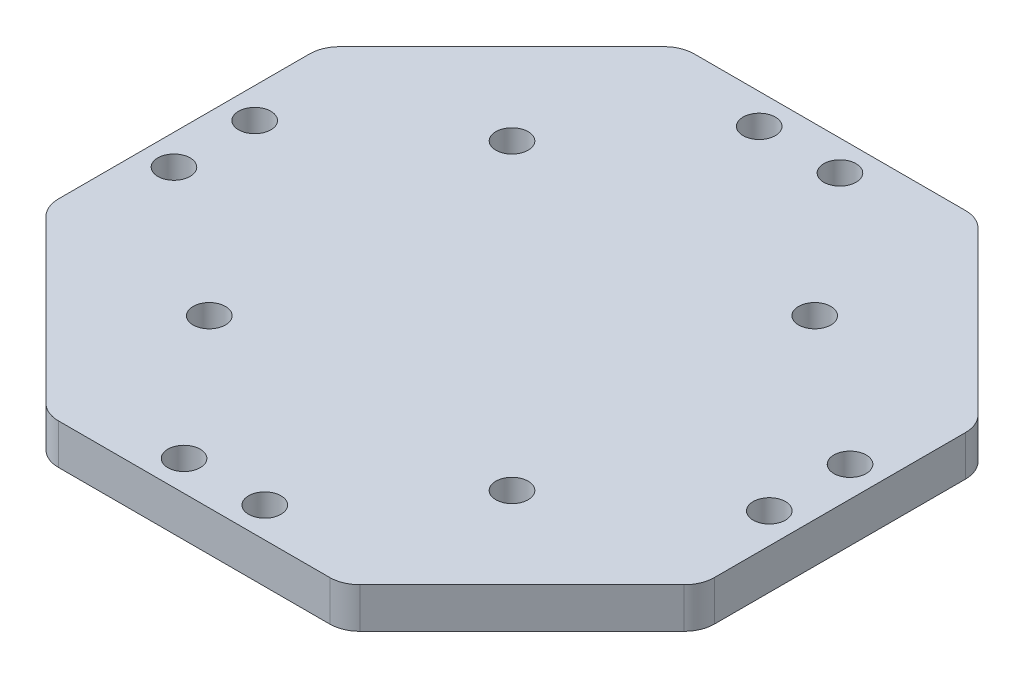
ISO-10303-21;
HEADER;
FILE_DESCRIPTION(('STEP AP214'),'2;1');
FILE_NAME('part.step','',(''),(''),'','','');
FILE_SCHEMA(('AUTOMOTIVE_DESIGN { 1 0 10303 214 1 1 1 1 }'));
ENDSEC;
DATA;
#1=APPLICATION_CONTEXT('core data for automotive mechanical design processes');
#2=APPLICATION_PROTOCOL_DEFINITION('international standard','automotive_design',2000,#1);
#3=PRODUCT_CONTEXT('',#1,'mechanical');
#4=PRODUCT('Part','Part','',(#3));
#5=PRODUCT_RELATED_PRODUCT_CATEGORY('part','',(#4));
#6=PRODUCT_DEFINITION_FORMATION('','',#4);
#7=PRODUCT_DEFINITION_CONTEXT('part definition',#1,'design');
#8=PRODUCT_DEFINITION('design','',#6,#7);
#9=PRODUCT_DEFINITION_SHAPE('','',#8);
#10=(LENGTH_UNIT() NAMED_UNIT(*) SI_UNIT(.MILLI.,.METRE.));
#11=(NAMED_UNIT(*) PLANE_ANGLE_UNIT() SI_UNIT($,.RADIAN.));
#12=(NAMED_UNIT(*) SI_UNIT($,.STERADIAN.) SOLID_ANGLE_UNIT());
#13=UNCERTAINTY_MEASURE_WITH_UNIT(LENGTH_MEASURE(1.E-05),#10,'distance_accuracy_value','');
#14=(GEOMETRIC_REPRESENTATION_CONTEXT(3) GLOBAL_UNCERTAINTY_ASSIGNED_CONTEXT((#13)) GLOBAL_UNIT_ASSIGNED_CONTEXT((#10,
#11,#12)) REPRESENTATION_CONTEXT('',''));
#15=CARTESIAN_POINT('',(0.,0.,0.));
#16=DIRECTION('',(0.,0.,1.));
#17=DIRECTION('',(1.,0.,0.));
#18=AXIS2_PLACEMENT_3D('',#15,#16,#17);
#19=CARTESIAN_POINT('',(32.5,4.,-31.5));
#20=DIRECTION('',(-1.,0.,0.));
#21=DIRECTION('',(0.,0.,1.));
#22=AXIS2_PLACEMENT_3D('',#19,#20,#21);
#23=PLANE('',#22);
#24=DIRECTION('',(0.,0.,-1.));
#25=VECTOR('',#24,1.);
#26=CARTESIAN_POINT('',(32.5,0.,-31.5));
#27=LINE('',#26,#25);
#28=CARTESIAN_POINT('',(32.5,0.,12.4391484971834));
#29=VERTEX_POINT('',#28);
#30=CARTESIAN_POINT('',(32.5,0.,-12.4391484971834));
#31=VERTEX_POINT('',#30);
#32=EDGE_CURVE('E267',#29,#31,#27,.T.);
#33=ORIENTED_EDGE('',*,*,#32,.T.);
#34=DIRECTION('',(0.,1.,0.));
#35=VECTOR('',#34,1.);
#36=CARTESIAN_POINT('',(32.5,4.,-12.4391484971834));
#37=LINE('',#36,#35);
#38=CARTESIAN_POINT('',(32.5,4.,-12.4391484971834));
#39=VERTEX_POINT('',#38);
#40=EDGE_CURVE('E170',#31,#39,#37,.T.);
#41=ORIENTED_EDGE('',*,*,#40,.T.);
#42=DIRECTION('',(0.,0.,-1.));
#43=VECTOR('',#42,1.);
#44=CARTESIAN_POINT('',(32.5,4.,-31.5));
#45=LINE('',#44,#43);
#46=CARTESIAN_POINT('',(32.5,4.,12.4391484971834));
#47=VERTEX_POINT('',#46);
#48=EDGE_CURVE('E154',#47,#39,#45,.T.);
#49=ORIENTED_EDGE('',*,*,#48,.F.);
#50=DIRECTION('',(0.,-1.,0.));
#51=VECTOR('',#50,1.);
#52=CARTESIAN_POINT('',(32.5,4.,12.4391484971834));
#53=LINE('',#52,#51);
#54=EDGE_CURVE('E167',#47,#29,#53,.T.);
#55=ORIENTED_EDGE('',*,*,#54,.T.);
#56=EDGE_LOOP('',(#33,#41,#49,#55));
#57=FACE_BOUND('',#56,.T.);
#58=ADVANCED_FACE('F34',(#57),#23,.F.);
#59=CARTESIAN_POINT('',(-32.5,4.,-31.5));
#60=DIRECTION('',(0.,0.,1.));
#61=DIRECTION('',(1.,0.,0.));
#62=AXIS2_PLACEMENT_3D('',#59,#60,#61);
#63=PLANE('',#62);
#64=DIRECTION('',(-1.,0.,0.));
#65=VECTOR('',#64,1.);
#66=CARTESIAN_POINT('',(-32.5,4.,-31.5));
#67=LINE('',#66,#65);
#68=CARTESIAN_POINT('',(13.4391484971834,4.,-31.5));
#69=VERTEX_POINT('',#68);
#70=CARTESIAN_POINT('',(-13.4391484971834,4.,-31.5));
#71=VERTEX_POINT('',#70);
#72=EDGE_CURVE('E171',#69,#71,#67,.T.);
#73=ORIENTED_EDGE('',*,*,#72,.F.);
#74=DIRECTION('',(0.,-1.,0.));
#75=VECTOR('',#74,1.);
#76=CARTESIAN_POINT('',(13.4391484971834,4.,-31.5));
#77=LINE('',#76,#75);
#78=CARTESIAN_POINT('',(13.4391484971834,0.,-31.5));
#79=VERTEX_POINT('',#78);
#80=EDGE_CURVE('E216',#69,#79,#77,.T.);
#81=ORIENTED_EDGE('',*,*,#80,.T.);
#82=DIRECTION('',(-1.,0.,0.));
#83=VECTOR('',#82,1.);
#84=CARTESIAN_POINT('',(-32.5,0.,-31.5));
#85=LINE('',#84,#83);
#86=CARTESIAN_POINT('',(-13.4391484971834,0.,-31.5));
#87=VERTEX_POINT('',#86);
#88=EDGE_CURVE('E269',#79,#87,#85,.T.);
#89=ORIENTED_EDGE('',*,*,#88,.T.);
#90=DIRECTION('',(0.,1.,0.));
#91=VECTOR('',#90,1.);
#92=CARTESIAN_POINT('',(-13.4391484971834,4.,-31.5));
#93=LINE('',#92,#91);
#94=EDGE_CURVE('E213',#87,#71,#93,.T.);
#95=ORIENTED_EDGE('',*,*,#94,.T.);
#96=EDGE_LOOP('',(#73,#81,#89,#95));
#97=FACE_BOUND('',#96,.T.);
#98=ADVANCED_FACE('F287',(#97),#63,.F.);
#99=CARTESIAN_POINT('',(-32.5,4.,-31.5));
#100=DIRECTION('',(1.,0.,0.));
#101=DIRECTION('',(0.,0.,-1.));
#102=AXIS2_PLACEMENT_3D('',#99,#100,#101);
#103=PLANE('',#102);
#104=DIRECTION('',(0.,0.,1.));
#105=VECTOR('',#104,1.);
#106=CARTESIAN_POINT('',(-32.5,4.,-31.5));
#107=LINE('',#106,#105);
#108=CARTESIAN_POINT('',(-32.5,4.,-12.4391484971834));
#109=VERTEX_POINT('',#108);
#110=CARTESIAN_POINT('',(-32.5,4.,12.4391484971834));
#111=VERTEX_POINT('',#110);
#112=EDGE_CURVE('E258',#109,#111,#107,.T.);
#113=ORIENTED_EDGE('',*,*,#112,.F.);
#114=DIRECTION('',(0.,-1.,0.));
#115=VECTOR('',#114,1.);
#116=CARTESIAN_POINT('',(-32.5,4.,-12.4391484971834));
#117=LINE('',#116,#115);
#118=CARTESIAN_POINT('',(-32.5,0.,-12.4391484971834));
#119=VERTEX_POINT('',#118);
#120=EDGE_CURVE('E225',#109,#119,#117,.T.);
#121=ORIENTED_EDGE('',*,*,#120,.T.);
#122=DIRECTION('',(0.,0.,1.));
#123=VECTOR('',#122,1.);
#124=CARTESIAN_POINT('',(-32.5,0.,-31.5));
#125=LINE('',#124,#123);
#126=CARTESIAN_POINT('',(-32.5,0.,12.4391484971834));
#127=VERTEX_POINT('',#126);
#128=EDGE_CURVE('E272',#119,#127,#125,.T.);
#129=ORIENTED_EDGE('',*,*,#128,.T.);
#130=DIRECTION('',(0.,1.,0.));
#131=VECTOR('',#130,1.);
#132=CARTESIAN_POINT('',(-32.5,4.,12.4391484971834));
#133=LINE('',#132,#131);
#134=EDGE_CURVE('E222',#127,#111,#133,.T.);
#135=ORIENTED_EDGE('',*,*,#134,.T.);
#136=EDGE_LOOP('',(#113,#121,#129,#135));
#137=FACE_BOUND('',#136,.T.);
#138=ADVANCED_FACE('F394',(#137),#103,.F.);
#139=CARTESIAN_POINT('',(-32.5,4.,31.5));
#140=DIRECTION('',(0.,0.,-1.));
#141=DIRECTION('',(-1.,0.,0.));
#142=AXIS2_PLACEMENT_3D('',#139,#140,#141);
#143=PLANE('',#142);
#144=DIRECTION('',(1.,0.,0.));
#145=VECTOR('',#144,1.);
#146=CARTESIAN_POINT('',(-32.5,4.,31.5));
#147=LINE('',#146,#145);
#148=CARTESIAN_POINT('',(-13.4391484971834,4.,31.5));
#149=VERTEX_POINT('',#148);
#150=CARTESIAN_POINT('',(13.4391484971834,4.,31.5));
#151=VERTEX_POINT('',#150);
#152=EDGE_CURVE('E253',#149,#151,#147,.T.);
#153=ORIENTED_EDGE('',*,*,#152,.F.);
#154=DIRECTION('',(0.,-1.,0.));
#155=VECTOR('',#154,1.);
#156=CARTESIAN_POINT('',(-13.4391484971834,4.,31.5));
#157=LINE('',#156,#155);
#158=CARTESIAN_POINT('',(-13.4391484971834,0.,31.5));
#159=VERTEX_POINT('',#158);
#160=EDGE_CURVE('E231',#149,#159,#157,.T.);
#161=ORIENTED_EDGE('',*,*,#160,.T.);
#162=DIRECTION('',(1.,0.,0.));
#163=VECTOR('',#162,1.);
#164=CARTESIAN_POINT('',(-32.5,0.,31.5));
#165=LINE('',#164,#163);
#166=CARTESIAN_POINT('',(13.4391484971834,0.,31.5));
#167=VERTEX_POINT('',#166);
#168=EDGE_CURVE('E172',#159,#167,#165,.T.);
#169=ORIENTED_EDGE('',*,*,#168,.T.);
#170=DIRECTION('',(0.,1.,0.));
#171=VECTOR('',#170,1.);
#172=CARTESIAN_POINT('',(13.4391484971834,4.,31.5));
#173=LINE('',#172,#171);
#174=EDGE_CURVE('E228',#167,#151,#173,.T.);
#175=ORIENTED_EDGE('',*,*,#174,.T.);
#176=EDGE_LOOP('',(#153,#161,#169,#175));
#177=FACE_BOUND('',#176,.T.);
#178=ADVANCED_FACE('F252',(#177),#143,.F.);
#179=CARTESIAN_POINT('',(0.,4.,0.));
#180=DIRECTION('',(0.,1.,0.));
#181=DIRECTION('',(0.,0.,1.));
#182=AXIS2_PLACEMENT_3D('',#179,#180,#181);
#183=PLANE('',#182);
#184=ORIENTED_EDGE('',*,*,#48,.T.);
#185=CARTESIAN_POINT('',(29.5,4.,-12.4391484971834));
#186=DIRECTION('',(0.,1.,0.));
#187=DIRECTION('',(0.,0.,1.));
#188=AXIS2_PLACEMENT_3D('',#185,#186,#187);
#189=CIRCLE('',#188,3.);
#190=CARTESIAN_POINT('',(31.6213203435596,4.,-14.560468840743));
#191=VERTEX_POINT('',#190);
#192=EDGE_CURVE('E194',#39,#191,#189,.T.);
#193=ORIENTED_EDGE('',*,*,#192,.T.);
#194=DIRECTION('',(0.707106781186547,0.,0.707106781186548));
#195=VECTOR('',#194,1.);
#196=CARTESIAN_POINT('',(9.68178918430267,4.,-36.5));
#197=LINE('',#196,#195);
#198=CARTESIAN_POINT('',(15.560468840743,4.,-30.6213203435596));
#199=VERTEX_POINT('',#198);
#200=EDGE_CURVE('E369',#199,#191,#197,.T.);
#201=ORIENTED_EDGE('',*,*,#200,.F.);
#202=CARTESIAN_POINT('',(13.4391484971834,4.,-28.5));
#203=DIRECTION('',(0.,1.,0.));
#204=DIRECTION('',(0.,0.,1.));
#205=AXIS2_PLACEMENT_3D('',#202,#203,#204);
#206=CIRCLE('',#205,3.);
#207=EDGE_CURVE('E192',#199,#69,#206,.T.);
#208=ORIENTED_EDGE('',*,*,#207,.T.);
#209=ORIENTED_EDGE('',*,*,#72,.T.);
#210=CARTESIAN_POINT('',(-13.4391484971834,4.,-28.5));
#211=DIRECTION('',(0.,1.,0.));
#212=DIRECTION('',(0.,0.,1.));
#213=AXIS2_PLACEMENT_3D('',#210,#211,#212);
#214=CIRCLE('',#213,3.);
#215=CARTESIAN_POINT('',(-15.560468840743,4.,-30.6213203435596));
#216=VERTEX_POINT('',#215);
#217=EDGE_CURVE('E190',#71,#216,#214,.T.);
#218=ORIENTED_EDGE('',*,*,#217,.T.);
#219=DIRECTION('',(0.707106781186548,0.,-0.707106781186547));
#220=VECTOR('',#219,1.);
#221=CARTESIAN_POINT('',(-9.68178918430264,4.,-36.5));
#222=LINE('',#221,#220);
#223=CARTESIAN_POINT('',(-31.6213203435596,4.,-14.560468840743));
#224=VERTEX_POINT('',#223);
#225=EDGE_CURVE('E367',#224,#216,#222,.T.);
#226=ORIENTED_EDGE('',*,*,#225,.F.);
#227=CARTESIAN_POINT('',(-29.5,4.,-12.4391484971834));
#228=DIRECTION('',(0.,1.,0.));
#229=DIRECTION('',(0.,0.,1.));
#230=AXIS2_PLACEMENT_3D('',#227,#228,#229);
#231=CIRCLE('',#230,3.);
#232=EDGE_CURVE('E188',#224,#109,#231,.T.);
#233=ORIENTED_EDGE('',*,*,#232,.T.);
#234=ORIENTED_EDGE('',*,*,#112,.T.);
#235=CARTESIAN_POINT('',(-29.5,4.,12.4391484971834));
#236=DIRECTION('',(0.,1.,0.));
#237=DIRECTION('',(0.,0.,1.));
#238=AXIS2_PLACEMENT_3D('',#235,#236,#237);
#239=CIRCLE('',#238,3.);
#240=CARTESIAN_POINT('',(-31.6213203435596,4.,14.560468840743));
#241=VERTEX_POINT('',#240);
#242=EDGE_CURVE('E161',#111,#241,#239,.T.);
#243=ORIENTED_EDGE('',*,*,#242,.T.);
#244=DIRECTION('',(-0.707106781186548,0.,-0.707106781186547));
#245=VECTOR('',#244,1.);
#246=CARTESIAN_POINT('',(-9.68178918430265,4.,36.5));
#247=LINE('',#246,#245);
#248=CARTESIAN_POINT('',(-15.560468840743,4.,30.6213203435596));
#249=VERTEX_POINT('',#248);
#250=EDGE_CURVE('E345',#249,#241,#247,.T.);
#251=ORIENTED_EDGE('',*,*,#250,.F.);
#252=CARTESIAN_POINT('',(-13.4391484971834,4.,28.5));
#253=DIRECTION('',(0.,1.,0.));
#254=DIRECTION('',(0.,0.,1.));
#255=AXIS2_PLACEMENT_3D('',#252,#253,#254);
#256=CIRCLE('',#255,3.);
#257=EDGE_CURVE('E186',#249,#149,#256,.T.);
#258=ORIENTED_EDGE('',*,*,#257,.T.);
#259=ORIENTED_EDGE('',*,*,#152,.T.);
#260=CARTESIAN_POINT('',(13.4391484971834,4.,28.5));
#261=DIRECTION('',(0.,1.,0.));
#262=DIRECTION('',(0.,0.,1.));
#263=AXIS2_PLACEMENT_3D('',#260,#261,#262);
#264=CIRCLE('',#263,3.);
#265=CARTESIAN_POINT('',(15.560468840743,4.,30.6213203435596));
#266=VERTEX_POINT('',#265);
#267=EDGE_CURVE('E160',#151,#266,#264,.T.);
#268=ORIENTED_EDGE('',*,*,#267,.T.);
#269=DIRECTION('',(-0.707106781186547,0.,0.707106781186548));
#270=VECTOR('',#269,1.);
#271=CARTESIAN_POINT('',(9.68178918430267,4.,36.5));
#272=LINE('',#271,#270);
#273=CARTESIAN_POINT('',(31.6213203435596,4.,14.560468840743));
#274=VERTEX_POINT('',#273);
#275=EDGE_CURVE('E156',#274,#266,#272,.T.);
#276=ORIENTED_EDGE('',*,*,#275,.F.);
#277=CARTESIAN_POINT('',(29.5,4.,12.4391484971834));
#278=DIRECTION('',(0.,1.,0.));
#279=DIRECTION('',(0.,0.,1.));
#280=AXIS2_PLACEMENT_3D('',#277,#278,#279);
#281=CIRCLE('',#280,3.);
#282=EDGE_CURVE('E150',#274,#47,#281,.T.);
#283=ORIENTED_EDGE('',*,*,#282,.T.);
#284=EDGE_LOOP('',(#184,#193,#201,#208,#209,#218,#226,#233,#234,#243,#251,#258,#259,#268,#276,#283));
#285=FACE_BOUND('',#284,.T.);
#286=CARTESIAN_POINT('',(29.5,4.,4.));
#287=DIRECTION('',(0.,1.,0.));
#288=DIRECTION('',(0.,0.,-1.));
#289=AXIS2_PLACEMENT_3D('',#286,#287,#288);
#290=CIRCLE('',#289,1.60000000000001);
#291=CARTESIAN_POINT('',(29.5,4.,2.4));
#292=VERTEX_POINT('',#291);
#293=EDGE_CURVE('E341',#292,#292,#290,.T.);
#294=ORIENTED_EDGE('',*,*,#293,.F.);
#295=EDGE_LOOP('',(#294));
#296=FACE_BOUND('',#295,.T.);
#297=CARTESIAN_POINT('',(29.5,4.,-4.));
#298=DIRECTION('',(0.,1.,0.));
#299=DIRECTION('',(0.,0.,1.));
#300=AXIS2_PLACEMENT_3D('',#297,#298,#299);
#301=CIRCLE('',#300,1.60000000000001);
#302=CARTESIAN_POINT('',(29.5,4.,-2.4));
#303=VERTEX_POINT('',#302);
#304=EDGE_CURVE('E348',#303,#303,#301,.T.);
#305=ORIENTED_EDGE('',*,*,#304,.F.);
#306=EDGE_LOOP('',(#305));
#307=FACE_BOUND('',#306,.T.);
#308=CARTESIAN_POINT('',(-29.5,4.,-3.99999999999999));
#309=DIRECTION('',(0.,1.,0.));
#310=DIRECTION('',(0.,0.,-1.));
#311=AXIS2_PLACEMENT_3D('',#308,#309,#310);
#312=CIRCLE('',#311,1.60000000000001);
#313=CARTESIAN_POINT('',(-29.5,4.,-5.6));
#314=VERTEX_POINT('',#313);
#315=EDGE_CURVE('E354',#314,#314,#312,.T.);
#316=ORIENTED_EDGE('',*,*,#315,.F.);
#317=EDGE_LOOP('',(#316));
#318=FACE_BOUND('',#317,.T.);
#319=CARTESIAN_POINT('',(-29.5,4.,4.00000000000001));
#320=DIRECTION('',(0.,1.,0.));
#321=DIRECTION('',(0.,0.,1.));
#322=AXIS2_PLACEMENT_3D('',#319,#320,#321);
#323=CIRCLE('',#322,1.60000000000001);
#324=CARTESIAN_POINT('',(-29.5,4.,5.60000000000001));
#325=VERTEX_POINT('',#324);
#326=EDGE_CURVE('E360',#325,#325,#323,.T.);
#327=ORIENTED_EDGE('',*,*,#326,.F.);
#328=EDGE_LOOP('',(#327));
#329=FACE_BOUND('',#328,.T.);
#330=CARTESIAN_POINT('',(-4.,4.,-28.5));
#331=DIRECTION('',(0.,1.,0.));
#332=DIRECTION('',(0.,0.,-1.));
#333=AXIS2_PLACEMENT_3D('',#330,#331,#332);
#334=CIRCLE('',#333,1.6);
#335=CARTESIAN_POINT('',(-4.,4.,-30.1));
#336=VERTEX_POINT('',#335);
#337=EDGE_CURVE('E323',#336,#336,#334,.T.);
#338=ORIENTED_EDGE('',*,*,#337,.F.);
#339=EDGE_LOOP('',(#338));
#340=FACE_BOUND('',#339,.T.);
#341=CARTESIAN_POINT('',(4.,4.,-28.5));
#342=DIRECTION('',(0.,1.,0.));
#343=DIRECTION('',(0.,0.,1.));
#344=AXIS2_PLACEMENT_3D('',#341,#342,#343);
#345=CIRCLE('',#344,1.6);
#346=CARTESIAN_POINT('',(4.,4.,-26.9));
#347=VERTEX_POINT('',#346);
#348=EDGE_CURVE('E330',#347,#347,#345,.T.);
#349=ORIENTED_EDGE('',*,*,#348,.F.);
#350=EDGE_LOOP('',(#349));
#351=FACE_BOUND('',#350,.T.);
#352=CARTESIAN_POINT('',(4.00000000000001,4.,28.5));
#353=DIRECTION('',(0.,1.,0.));
#354=DIRECTION('',(0.,0.,-1.));
#355=AXIS2_PLACEMENT_3D('',#352,#353,#354);
#356=CIRCLE('',#355,1.6);
#357=CARTESIAN_POINT('',(4.00000000000001,4.,26.9));
#358=VERTEX_POINT('',#357);
#359=EDGE_CURVE('E336',#358,#358,#356,.T.);
#360=ORIENTED_EDGE('',*,*,#359,.F.);
#361=EDGE_LOOP('',(#360));
#362=FACE_BOUND('',#361,.T.);
#363=CARTESIAN_POINT('',(-3.99999999999999,4.,28.5));
#364=DIRECTION('',(0.,1.,0.));
#365=DIRECTION('',(0.,0.,1.));
#366=AXIS2_PLACEMENT_3D('',#363,#364,#365);
#367=CIRCLE('',#366,1.6);
#368=CARTESIAN_POINT('',(-3.99999999999999,4.,30.1));
#369=VERTEX_POINT('',#368);
#370=EDGE_CURVE('E317',#369,#369,#367,.T.);
#371=ORIENTED_EDGE('',*,*,#370,.F.);
#372=EDGE_LOOP('',(#371));
#373=FACE_BOUND('',#372,.T.);
#374=CARTESIAN_POINT('',(-15.,4.,-15.));
#375=DIRECTION('',(0.,1.,0.));
#376=DIRECTION('',(0.,0.,-1.));
#377=AXIS2_PLACEMENT_3D('',#374,#375,#376);
#378=CIRCLE('',#377,1.6);
#379=CARTESIAN_POINT('',(-15.,4.,-16.6));
#380=VERTEX_POINT('',#379);
#381=EDGE_CURVE('E312',#380,#380,#378,.T.);
#382=ORIENTED_EDGE('',*,*,#381,.F.);
#383=EDGE_LOOP('',(#382));
#384=FACE_BOUND('',#383,.T.);
#385=CARTESIAN_POINT('',(15.,4.,-15.));
#386=DIRECTION('',(0.,1.,0.));
#387=DIRECTION('',(0.,0.,1.));
#388=AXIS2_PLACEMENT_3D('',#385,#386,#387);
#389=CIRCLE('',#388,1.6);
#390=CARTESIAN_POINT('',(15.,4.,-13.4));
#391=VERTEX_POINT('',#390);
#392=EDGE_CURVE('E306',#391,#391,#389,.T.);
#393=ORIENTED_EDGE('',*,*,#392,.F.);
#394=EDGE_LOOP('',(#393));
#395=FACE_BOUND('',#394,.T.);
#396=CARTESIAN_POINT('',(15.,4.,15.));
#397=DIRECTION('',(0.,1.,0.));
#398=DIRECTION('',(0.,0.,-1.));
#399=AXIS2_PLACEMENT_3D('',#396,#397,#398);
#400=CIRCLE('',#399,1.6);
#401=CARTESIAN_POINT('',(15.,4.,13.4));
#402=VERTEX_POINT('',#401);
#403=EDGE_CURVE('E299',#402,#402,#400,.T.);
#404=ORIENTED_EDGE('',*,*,#403,.F.);
#405=EDGE_LOOP('',(#404));
#406=FACE_BOUND('',#405,.T.);
#407=CARTESIAN_POINT('',(-15.,4.,15.));
#408=DIRECTION('',(0.,1.,0.));
#409=DIRECTION('',(0.,0.,1.));
#410=AXIS2_PLACEMENT_3D('',#407,#408,#409);
#411=CIRCLE('',#410,1.6);
#412=CARTESIAN_POINT('',(-15.,4.,16.6));
#413=VERTEX_POINT('',#412);
#414=EDGE_CURVE('E293',#413,#413,#411,.T.);
#415=ORIENTED_EDGE('',*,*,#414,.F.);
#416=EDGE_LOOP('',(#415));
#417=FACE_BOUND('',#416,.T.);
#418=ADVANCED_FACE('F152',(#285,#296,#307,#318,#329,#340,#351,#362,#373,#384,#395,#406,#417),
#183,.T.);
#419=CARTESIAN_POINT('',(0.,0.,0.));
#420=DIRECTION('',(0.,1.,0.));
#421=DIRECTION('',(0.,0.,1.));
#422=AXIS2_PLACEMENT_3D('',#419,#420,#421);
#423=PLANE('',#422);
#424=CARTESIAN_POINT('',(29.5,0.,4.));
#425=DIRECTION('',(0.,1.,0.));
#426=DIRECTION('',(0.,0.,-1.));
#427=AXIS2_PLACEMENT_3D('',#424,#425,#426);
#428=CIRCLE('',#427,1.60000000000001);
#429=CARTESIAN_POINT('',(29.5,0.,2.4));
#430=VERTEX_POINT('',#429);
#431=EDGE_CURVE('E344',#430,#430,#428,.T.);
#432=ORIENTED_EDGE('',*,*,#431,.T.);
#433=EDGE_LOOP('',(#432));
#434=FACE_BOUND('',#433,.T.);
#435=CARTESIAN_POINT('',(29.5,0.,-4.));
#436=DIRECTION('',(0.,1.,0.));
#437=DIRECTION('',(0.,0.,1.));
#438=AXIS2_PLACEMENT_3D('',#435,#436,#437);
#439=CIRCLE('',#438,1.60000000000001);
#440=CARTESIAN_POINT('',(29.5,0.,-2.4));
#441=VERTEX_POINT('',#440);
#442=EDGE_CURVE('E351',#441,#441,#439,.T.);
#443=ORIENTED_EDGE('',*,*,#442,.T.);
#444=EDGE_LOOP('',(#443));
#445=FACE_BOUND('',#444,.T.);
#446=CARTESIAN_POINT('',(-29.5,0.,-3.99999999999999));
#447=DIRECTION('',(0.,1.,0.));
#448=DIRECTION('',(0.,0.,-1.));
#449=AXIS2_PLACEMENT_3D('',#446,#447,#448);
#450=CIRCLE('',#449,1.60000000000001);
#451=CARTESIAN_POINT('',(-29.5,0.,-5.6));
#452=VERTEX_POINT('',#451);
#453=EDGE_CURVE('E357',#452,#452,#450,.T.);
#454=ORIENTED_EDGE('',*,*,#453,.T.);
#455=EDGE_LOOP('',(#454));
#456=FACE_BOUND('',#455,.T.);
#457=CARTESIAN_POINT('',(-29.5,0.,4.00000000000001));
#458=DIRECTION('',(0.,1.,0.));
#459=DIRECTION('',(0.,0.,1.));
#460=AXIS2_PLACEMENT_3D('',#457,#458,#459);
#461=CIRCLE('',#460,1.60000000000001);
#462=CARTESIAN_POINT('',(-29.5,0.,5.60000000000001));
#463=VERTEX_POINT('',#462);
#464=EDGE_CURVE('E327',#463,#463,#461,.T.);
#465=ORIENTED_EDGE('',*,*,#464,.T.);
#466=EDGE_LOOP('',(#465));
#467=FACE_BOUND('',#466,.T.);
#468=CARTESIAN_POINT('',(-4.,0.,-28.5));
#469=DIRECTION('',(0.,1.,0.));
#470=DIRECTION('',(0.,0.,-1.));
#471=AXIS2_PLACEMENT_3D('',#468,#469,#470);
#472=CIRCLE('',#471,1.6);
#473=CARTESIAN_POINT('',(-4.,0.,-30.1));
#474=VERTEX_POINT('',#473);
#475=EDGE_CURVE('E326',#474,#474,#472,.T.);
#476=ORIENTED_EDGE('',*,*,#475,.T.);
#477=EDGE_LOOP('',(#476));
#478=FACE_BOUND('',#477,.T.);
#479=CARTESIAN_POINT('',(4.,0.,-28.5));
#480=DIRECTION('',(0.,1.,0.));
#481=DIRECTION('',(0.,0.,1.));
#482=AXIS2_PLACEMENT_3D('',#479,#480,#481);
#483=CIRCLE('',#482,1.6);
#484=CARTESIAN_POINT('',(4.,0.,-26.9));
#485=VERTEX_POINT('',#484);
#486=EDGE_CURVE('E333',#485,#485,#483,.T.);
#487=ORIENTED_EDGE('',*,*,#486,.T.);
#488=EDGE_LOOP('',(#487));
#489=FACE_BOUND('',#488,.T.);
#490=CARTESIAN_POINT('',(4.00000000000001,0.,28.5));
#491=DIRECTION('',(0.,1.,0.));
#492=DIRECTION('',(0.,0.,-1.));
#493=AXIS2_PLACEMENT_3D('',#490,#491,#492);
#494=CIRCLE('',#493,1.6);
#495=CARTESIAN_POINT('',(4.00000000000001,0.,26.9));
#496=VERTEX_POINT('',#495);
#497=EDGE_CURVE('E320',#496,#496,#494,.T.);
#498=ORIENTED_EDGE('',*,*,#497,.T.);
#499=EDGE_LOOP('',(#498));
#500=FACE_BOUND('',#499,.T.);
#501=CARTESIAN_POINT('',(-3.99999999999999,0.,28.5));
#502=DIRECTION('',(0.,1.,0.));
#503=DIRECTION('',(0.,0.,1.));
#504=AXIS2_PLACEMENT_3D('',#501,#502,#503);
#505=CIRCLE('',#504,1.6);
#506=CARTESIAN_POINT('',(-3.99999999999999,0.,30.1));
#507=VERTEX_POINT('',#506);
#508=EDGE_CURVE('E303',#507,#507,#505,.T.);
#509=ORIENTED_EDGE('',*,*,#508,.T.);
#510=EDGE_LOOP('',(#509));
#511=FACE_BOUND('',#510,.T.);
#512=CARTESIAN_POINT('',(-15.,0.,-15.));
#513=DIRECTION('',(0.,1.,0.));
#514=DIRECTION('',(0.,0.,-1.));
#515=AXIS2_PLACEMENT_3D('',#512,#513,#514);
#516=CIRCLE('',#515,1.6);
#517=CARTESIAN_POINT('',(-15.,0.,-16.6));
#518=VERTEX_POINT('',#517);
#519=EDGE_CURVE('E296',#518,#518,#516,.T.);
#520=ORIENTED_EDGE('',*,*,#519,.T.);
#521=EDGE_LOOP('',(#520));
#522=FACE_BOUND('',#521,.T.);
#523=CARTESIAN_POINT('',(15.,0.,-15.));
#524=DIRECTION('',(0.,1.,0.));
#525=DIRECTION('',(0.,0.,1.));
#526=AXIS2_PLACEMENT_3D('',#523,#524,#525);
#527=CIRCLE('',#526,1.6);
#528=CARTESIAN_POINT('',(15.,0.,-13.4));
#529=VERTEX_POINT('',#528);
#530=EDGE_CURVE('E309',#529,#529,#527,.T.);
#531=ORIENTED_EDGE('',*,*,#530,.T.);
#532=EDGE_LOOP('',(#531));
#533=FACE_BOUND('',#532,.T.);
#534=CARTESIAN_POINT('',(15.,0.,15.));
#535=DIRECTION('',(0.,1.,0.));
#536=DIRECTION('',(0.,0.,-1.));
#537=AXIS2_PLACEMENT_3D('',#534,#535,#536);
#538=CIRCLE('',#537,1.6);
#539=CARTESIAN_POINT('',(15.,0.,13.4));
#540=VERTEX_POINT('',#539);
#541=EDGE_CURVE('E302',#540,#540,#538,.T.);
#542=ORIENTED_EDGE('',*,*,#541,.T.);
#543=EDGE_LOOP('',(#542));
#544=FACE_BOUND('',#543,.T.);
#545=CARTESIAN_POINT('',(-15.,0.,15.));
#546=DIRECTION('',(0.,1.,0.));
#547=DIRECTION('',(0.,0.,1.));
#548=AXIS2_PLACEMENT_3D('',#545,#546,#547);
#549=CIRCLE('',#548,1.6);
#550=CARTESIAN_POINT('',(-15.,0.,16.6));
#551=VERTEX_POINT('',#550);
#552=EDGE_CURVE('E270',#551,#551,#549,.T.);
#553=ORIENTED_EDGE('',*,*,#552,.T.);
#554=EDGE_LOOP('',(#553));
#555=FACE_BOUND('',#554,.T.);
#556=DIRECTION('',(0.707106781186547,0.,0.707106781186548));
#557=VECTOR('',#556,1.);
#558=CARTESIAN_POINT('',(23.0908945921513,0.,-23.0908945921513));
#559=LINE('',#558,#557);
#560=CARTESIAN_POINT('',(15.560468840743,0.,-30.6213203435596));
#561=VERTEX_POINT('',#560);
#562=CARTESIAN_POINT('',(31.6213203435596,0.,-14.560468840743));
#563=VERTEX_POINT('',#562);
#564=EDGE_CURVE('E261',#561,#563,#559,.T.);
#565=ORIENTED_EDGE('',*,*,#564,.T.);
#566=CARTESIAN_POINT('',(29.5,0.,-12.4391484971834));
#567=DIRECTION('',(0.,1.,0.));
#568=DIRECTION('',(0.,0.,1.));
#569=AXIS2_PLACEMENT_3D('',#566,#567,#568);
#570=CIRCLE('',#569,3.);
#571=EDGE_CURVE('E211',#563,#31,#570,.F.);
#572=ORIENTED_EDGE('',*,*,#571,.T.);
#573=ORIENTED_EDGE('',*,*,#32,.F.);
#574=CARTESIAN_POINT('',(29.5,0.,12.4391484971834));
#575=DIRECTION('',(0.,1.,0.));
#576=DIRECTION('',(0.,0.,1.));
#577=AXIS2_PLACEMENT_3D('',#574,#575,#576);
#578=CIRCLE('',#577,3.);
#579=CARTESIAN_POINT('',(31.6213203435596,0.,14.560468840743));
#580=VERTEX_POINT('',#579);
#581=EDGE_CURVE('E175',#29,#580,#578,.F.);
#582=ORIENTED_EDGE('',*,*,#581,.T.);
#583=DIRECTION('',(-0.707106781186547,0.,0.707106781186548));
#584=VECTOR('',#583,1.);
#585=CARTESIAN_POINT('',(23.0908945921513,0.,23.0908945921513));
#586=LINE('',#585,#584);
#587=CARTESIAN_POINT('',(15.560468840743,0.,30.6213203435596));
#588=VERTEX_POINT('',#587);
#589=EDGE_CURVE('E176',#580,#588,#586,.T.);
#590=ORIENTED_EDGE('',*,*,#589,.T.);
#591=CARTESIAN_POINT('',(13.4391484971834,0.,28.5));
#592=DIRECTION('',(0.,1.,0.));
#593=DIRECTION('',(0.,0.,1.));
#594=AXIS2_PLACEMENT_3D('',#591,#592,#593);
#595=CIRCLE('',#594,3.);
#596=EDGE_CURVE('E203',#588,#167,#595,.F.);
#597=ORIENTED_EDGE('',*,*,#596,.T.);
#598=ORIENTED_EDGE('',*,*,#168,.F.);
#599=CARTESIAN_POINT('',(-13.4391484971834,0.,28.5));
#600=DIRECTION('',(0.,1.,0.));
#601=DIRECTION('',(0.,0.,1.));
#602=AXIS2_PLACEMENT_3D('',#599,#600,#601);
#603=CIRCLE('',#602,3.);
#604=CARTESIAN_POINT('',(-15.560468840743,0.,30.6213203435596));
#605=VERTEX_POINT('',#604);
#606=EDGE_CURVE('E205',#159,#605,#603,.F.);
#607=ORIENTED_EDGE('',*,*,#606,.T.);
#608=DIRECTION('',(-0.707106781186548,0.,-0.707106781186547));
#609=VECTOR('',#608,1.);
#610=CARTESIAN_POINT('',(-23.0908945921513,0.,23.0908945921513));
#611=LINE('',#610,#609);
#612=CARTESIAN_POINT('',(-31.6213203435596,0.,14.560468840743));
#613=VERTEX_POINT('',#612);
#614=EDGE_CURVE('E257',#605,#613,#611,.T.);
#615=ORIENTED_EDGE('',*,*,#614,.T.);
#616=CARTESIAN_POINT('',(-29.5,0.,12.4391484971834));
#617=DIRECTION('',(0.,1.,0.));
#618=DIRECTION('',(0.,0.,1.));
#619=AXIS2_PLACEMENT_3D('',#616,#617,#618);
#620=CIRCLE('',#619,3.);
#621=EDGE_CURVE('E200',#613,#127,#620,.F.);
#622=ORIENTED_EDGE('',*,*,#621,.T.);
#623=ORIENTED_EDGE('',*,*,#128,.F.);
#624=CARTESIAN_POINT('',(-29.5,0.,-12.4391484971834));
#625=DIRECTION('',(0.,1.,0.));
#626=DIRECTION('',(0.,0.,1.));
#627=AXIS2_PLACEMENT_3D('',#624,#625,#626);
#628=CIRCLE('',#627,3.);
#629=CARTESIAN_POINT('',(-31.6213203435596,0.,-14.560468840743));
#630=VERTEX_POINT('',#629);
#631=EDGE_CURVE('E207',#119,#630,#628,.F.);
#632=ORIENTED_EDGE('',*,*,#631,.T.);
#633=DIRECTION('',(0.707106781186548,0.,-0.707106781186547));
#634=VECTOR('',#633,1.);
#635=CARTESIAN_POINT('',(-23.0908945921513,0.,-23.0908945921513));
#636=LINE('',#635,#634);
#637=CARTESIAN_POINT('',(-15.560468840743,0.,-30.6213203435596));
#638=VERTEX_POINT('',#637);
#639=EDGE_CURVE('E180',#630,#638,#636,.T.);
#640=ORIENTED_EDGE('',*,*,#639,.T.);
#641=CARTESIAN_POINT('',(-13.4391484971834,0.,-28.5));
#642=DIRECTION('',(0.,1.,0.));
#643=DIRECTION('',(0.,0.,1.));
#644=AXIS2_PLACEMENT_3D('',#641,#642,#643);
#645=CIRCLE('',#644,3.);
#646=EDGE_CURVE('E49',#638,#87,#645,.F.);
#647=ORIENTED_EDGE('',*,*,#646,.T.);
#648=ORIENTED_EDGE('',*,*,#88,.F.);
#649=CARTESIAN_POINT('',(13.4391484971834,0.,-28.5));
#650=DIRECTION('',(0.,1.,0.));
#651=DIRECTION('',(0.,0.,1.));
#652=AXIS2_PLACEMENT_3D('',#649,#650,#651);
#653=CIRCLE('',#652,3.);
#654=EDGE_CURVE('E57',#79,#561,#653,.F.);
#655=ORIENTED_EDGE('',*,*,#654,.T.);
#656=EDGE_LOOP('',(#565,#572,#573,#582,#590,#597,#598,#607,#615,#622,#623,#632,#640,#647,#648,#655));
#657=FACE_BOUND('',#656,.T.);
#658=ADVANCED_FACE('F243',(#434,#445,#456,#467,#478,#489,#500,#511,#522,#533,#544,#555,#657),
#423,.F.);
#659=CARTESIAN_POINT('',(-15.,0.,15.));
#660=DIRECTION('',(0.,1.,0.));
#661=DIRECTION('',(0.,0.,1.));
#662=AXIS2_PLACEMENT_3D('',#659,#660,#661);
#663=CYLINDRICAL_SURFACE('',#662,1.6);
#664=ORIENTED_EDGE('',*,*,#552,.F.);
#665=EDGE_LOOP('',(#664));
#666=FACE_BOUND('',#665,.T.);
#667=ORIENTED_EDGE('',*,*,#414,.T.);
#668=EDGE_LOOP('',(#667));
#669=FACE_BOUND('',#668,.T.);
#670=ADVANCED_FACE('F404',(#666,#669),#663,.F.);
#671=CARTESIAN_POINT('',(15.,0.,15.));
#672=DIRECTION('',(0.,1.,0.));
#673=DIRECTION('',(0.,0.,1.));
#674=AXIS2_PLACEMENT_3D('',#671,#672,#673);
#675=CYLINDRICAL_SURFACE('',#674,1.6);
#676=ORIENTED_EDGE('',*,*,#541,.F.);
#677=EDGE_LOOP('',(#676));
#678=FACE_BOUND('',#677,.T.);
#679=ORIENTED_EDGE('',*,*,#403,.T.);
#680=EDGE_LOOP('',(#679));
#681=FACE_BOUND('',#680,.T.);
#682=ADVANCED_FACE('F410',(#678,#681),#675,.F.);
#683=CARTESIAN_POINT('',(15.,0.,-15.));
#684=DIRECTION('',(0.,1.,0.));
#685=DIRECTION('',(0.,0.,1.));
#686=AXIS2_PLACEMENT_3D('',#683,#684,#685);
#687=CYLINDRICAL_SURFACE('',#686,1.6);
#688=ORIENTED_EDGE('',*,*,#530,.F.);
#689=EDGE_LOOP('',(#688));
#690=FACE_BOUND('',#689,.T.);
#691=ORIENTED_EDGE('',*,*,#392,.T.);
#692=EDGE_LOOP('',(#691));
#693=FACE_BOUND('',#692,.T.);
#694=ADVANCED_FACE('F414',(#690,#693),#687,.F.);
#695=CARTESIAN_POINT('',(-15.,0.,-15.));
#696=DIRECTION('',(0.,1.,0.));
#697=DIRECTION('',(0.,0.,1.));
#698=AXIS2_PLACEMENT_3D('',#695,#696,#697);
#699=CYLINDRICAL_SURFACE('',#698,1.6);
#700=ORIENTED_EDGE('',*,*,#519,.F.);
#701=EDGE_LOOP('',(#700));
#702=FACE_BOUND('',#701,.T.);
#703=ORIENTED_EDGE('',*,*,#381,.T.);
#704=EDGE_LOOP('',(#703));
#705=FACE_BOUND('',#704,.T.);
#706=ADVANCED_FACE('F418',(#702,#705),#699,.F.);
#707=CARTESIAN_POINT('',(-3.99999999999999,0.,28.5));
#708=DIRECTION('',(0.,1.,0.));
#709=DIRECTION('',(0.,0.,1.));
#710=AXIS2_PLACEMENT_3D('',#707,#708,#709);
#711=CYLINDRICAL_SURFACE('',#710,1.6);
#712=ORIENTED_EDGE('',*,*,#508,.F.);
#713=EDGE_LOOP('',(#712));
#714=FACE_BOUND('',#713,.T.);
#715=ORIENTED_EDGE('',*,*,#370,.T.);
#716=EDGE_LOOP('',(#715));
#717=FACE_BOUND('',#716,.T.);
#718=ADVANCED_FACE('F422',(#714,#717),#711,.F.);
#719=CARTESIAN_POINT('',(4.00000000000001,0.,28.5));
#720=DIRECTION('',(0.,1.,0.));
#721=DIRECTION('',(0.,0.,1.));
#722=AXIS2_PLACEMENT_3D('',#719,#720,#721);
#723=CYLINDRICAL_SURFACE('',#722,1.6);
#724=ORIENTED_EDGE('',*,*,#497,.F.);
#725=EDGE_LOOP('',(#724));
#726=FACE_BOUND('',#725,.T.);
#727=ORIENTED_EDGE('',*,*,#359,.T.);
#728=EDGE_LOOP('',(#727));
#729=FACE_BOUND('',#728,.T.);
#730=ADVANCED_FACE('F426',(#726,#729),#723,.F.);
#731=CARTESIAN_POINT('',(4.,0.,-28.5));
#732=DIRECTION('',(0.,1.,0.));
#733=DIRECTION('',(0.,0.,1.));
#734=AXIS2_PLACEMENT_3D('',#731,#732,#733);
#735=CYLINDRICAL_SURFACE('',#734,1.6);
#736=ORIENTED_EDGE('',*,*,#486,.F.);
#737=EDGE_LOOP('',(#736));
#738=FACE_BOUND('',#737,.T.);
#739=ORIENTED_EDGE('',*,*,#348,.T.);
#740=EDGE_LOOP('',(#739));
#741=FACE_BOUND('',#740,.T.);
#742=ADVANCED_FACE('F432',(#738,#741),#735,.F.);
#743=CARTESIAN_POINT('',(-4.,0.,-28.5));
#744=DIRECTION('',(0.,1.,0.));
#745=DIRECTION('',(0.,0.,1.));
#746=AXIS2_PLACEMENT_3D('',#743,#744,#745);
#747=CYLINDRICAL_SURFACE('',#746,1.6);
#748=ORIENTED_EDGE('',*,*,#475,.F.);
#749=EDGE_LOOP('',(#748));
#750=FACE_BOUND('',#749,.T.);
#751=ORIENTED_EDGE('',*,*,#337,.T.);
#752=EDGE_LOOP('',(#751));
#753=FACE_BOUND('',#752,.T.);
#754=ADVANCED_FACE('F428',(#750,#753),#747,.F.);
#755=CARTESIAN_POINT('',(-29.5,0.,4.00000000000001));
#756=DIRECTION('',(0.,1.,0.));
#757=DIRECTION('',(0.,0.,1.));
#758=AXIS2_PLACEMENT_3D('',#755,#756,#757);
#759=CYLINDRICAL_SURFACE('',#758,1.60000000000001);
#760=ORIENTED_EDGE('',*,*,#464,.F.);
#761=EDGE_LOOP('',(#760));
#762=FACE_BOUND('',#761,.T.);
#763=ORIENTED_EDGE('',*,*,#326,.T.);
#764=EDGE_LOOP('',(#763));
#765=FACE_BOUND('',#764,.T.);
#766=ADVANCED_FACE('F431',(#762,#765),#759,.F.);
#767=CARTESIAN_POINT('',(-29.5,0.,-3.99999999999999));
#768=DIRECTION('',(0.,1.,0.));
#769=DIRECTION('',(0.,0.,1.));
#770=AXIS2_PLACEMENT_3D('',#767,#768,#769);
#771=CYLINDRICAL_SURFACE('',#770,1.60000000000001);
#772=ORIENTED_EDGE('',*,*,#453,.F.);
#773=EDGE_LOOP('',(#772));
#774=FACE_BOUND('',#773,.T.);
#775=ORIENTED_EDGE('',*,*,#315,.T.);
#776=EDGE_LOOP('',(#775));
#777=FACE_BOUND('',#776,.T.);
#778=ADVANCED_FACE('F448',(#774,#777),#771,.F.);
#779=CARTESIAN_POINT('',(29.5,0.,-4.));
#780=DIRECTION('',(0.,1.,0.));
#781=DIRECTION('',(0.,0.,1.));
#782=AXIS2_PLACEMENT_3D('',#779,#780,#781);
#783=CYLINDRICAL_SURFACE('',#782,1.60000000000001);
#784=ORIENTED_EDGE('',*,*,#442,.F.);
#785=EDGE_LOOP('',(#784));
#786=FACE_BOUND('',#785,.T.);
#787=ORIENTED_EDGE('',*,*,#304,.T.);
#788=EDGE_LOOP('',(#787));
#789=FACE_BOUND('',#788,.T.);
#790=ADVANCED_FACE('F444',(#786,#789),#783,.F.);
#791=CARTESIAN_POINT('',(29.5,0.,4.));
#792=DIRECTION('',(0.,1.,0.));
#793=DIRECTION('',(0.,0.,1.));
#794=AXIS2_PLACEMENT_3D('',#791,#792,#793);
#795=CYLINDRICAL_SURFACE('',#794,1.60000000000001);
#796=ORIENTED_EDGE('',*,*,#431,.F.);
#797=EDGE_LOOP('',(#796));
#798=FACE_BOUND('',#797,.T.);
#799=ORIENTED_EDGE('',*,*,#293,.T.);
#800=EDGE_LOOP('',(#799));
#801=FACE_BOUND('',#800,.T.);
#802=ADVANCED_FACE('F440',(#798,#801),#795,.F.);
#803=CARTESIAN_POINT('',(-9.68178918430265,-6.,36.5));
#804=DIRECTION('',(0.707106781186547,0.,-0.707106781186548));
#805=DIRECTION('',(-0.707106781186548,0.,-0.707106781186547));
#806=AXIS2_PLACEMENT_3D('',#803,#804,#805);
#807=PLANE('',#806);
#808=ORIENTED_EDGE('',*,*,#614,.F.);
#809=DIRECTION('',(0.,-1.,0.));
#810=VECTOR('',#809,1.);
#811=CARTESIAN_POINT('',(-15.560468840743,-6.,30.6213203435596));
#812=LINE('',#811,#810);
#813=EDGE_CURVE('E236',#605,#249,#812,.F.);
#814=ORIENTED_EDGE('',*,*,#813,.T.);
#815=ORIENTED_EDGE('',*,*,#250,.T.);
#816=DIRECTION('',(0.,1.,0.));
#817=VECTOR('',#816,1.);
#818=CARTESIAN_POINT('',(-31.6213203435596,-6.,14.560468840743));
#819=LINE('',#818,#817);
#820=EDGE_CURVE('E234',#241,#613,#819,.F.);
#821=ORIENTED_EDGE('',*,*,#820,.T.);
#822=EDGE_LOOP('',(#808,#814,#815,#821));
#823=FACE_BOUND('',#822,.T.);
#824=ADVANCED_FACE('F443',(#823),#807,.F.);
#825=CARTESIAN_POINT('',(9.68178918430267,-6.,-36.5));
#826=DIRECTION('',(-0.707106781186548,0.,0.707106781186547));
#827=DIRECTION('',(0.707106781186547,0.,0.707106781186548));
#828=AXIS2_PLACEMENT_3D('',#825,#826,#827);
#829=PLANE('',#828);
#830=ORIENTED_EDGE('',*,*,#200,.T.);
#831=DIRECTION('',(0.,1.,0.));
#832=VECTOR('',#831,1.);
#833=CARTESIAN_POINT('',(31.6213203435596,-6.,-14.560468840743));
#834=LINE('',#833,#832);
#835=EDGE_CURVE('E198',#191,#563,#834,.F.);
#836=ORIENTED_EDGE('',*,*,#835,.T.);
#837=ORIENTED_EDGE('',*,*,#564,.F.);
#838=DIRECTION('',(0.,-1.,0.));
#839=VECTOR('',#838,1.);
#840=CARTESIAN_POINT('',(15.560468840743,-6.,-30.6213203435596));
#841=LINE('',#840,#839);
#842=EDGE_CURVE('E196',#561,#199,#841,.F.);
#843=ORIENTED_EDGE('',*,*,#842,.T.);
#844=EDGE_LOOP('',(#830,#836,#837,#843));
#845=FACE_BOUND('',#844,.T.);
#846=ADVANCED_FACE('F374',(#845),#829,.F.);
#847=CARTESIAN_POINT('',(-9.68178918430264,-6.,-36.5));
#848=DIRECTION('',(0.707106781186547,0.,0.707106781186548));
#849=DIRECTION('',(0.707106781186548,0.,-0.707106781186547));
#850=AXIS2_PLACEMENT_3D('',#847,#848,#849);
#851=PLANE('',#850);
#852=ORIENTED_EDGE('',*,*,#225,.T.);
#853=DIRECTION('',(0.,1.,0.));
#854=VECTOR('',#853,1.);
#855=CARTESIAN_POINT('',(-15.560468840743,-6.,-30.6213203435596));
#856=LINE('',#855,#854);
#857=EDGE_CURVE('E220',#216,#638,#856,.F.);
#858=ORIENTED_EDGE('',*,*,#857,.T.);
#859=ORIENTED_EDGE('',*,*,#639,.F.);
#860=DIRECTION('',(0.,-1.,0.));
#861=VECTOR('',#860,1.);
#862=CARTESIAN_POINT('',(-31.6213203435596,-6.,-14.560468840743));
#863=LINE('',#862,#861);
#864=EDGE_CURVE('E218',#630,#224,#863,.F.);
#865=ORIENTED_EDGE('',*,*,#864,.T.);
#866=EDGE_LOOP('',(#852,#858,#859,#865));
#867=FACE_BOUND('',#866,.T.);
#868=ADVANCED_FACE('F459',(#867),#851,.F.);
#869=CARTESIAN_POINT('',(9.68178918430267,-6.,36.5));
#870=DIRECTION('',(-0.707106781186548,0.,-0.707106781186547));
#871=DIRECTION('',(-0.707106781186547,0.,0.707106781186548));
#872=AXIS2_PLACEMENT_3D('',#869,#870,#871);
#873=PLANE('',#872);
#874=ORIENTED_EDGE('',*,*,#275,.T.);
#875=DIRECTION('',(0.,1.,0.));
#876=VECTOR('',#875,1.);
#877=CARTESIAN_POINT('',(15.560468840743,-6.,30.6213203435596));
#878=LINE('',#877,#876);
#879=EDGE_CURVE('E11',#266,#588,#878,.F.);
#880=ORIENTED_EDGE('',*,*,#879,.T.);
#881=ORIENTED_EDGE('',*,*,#589,.F.);
#882=DIRECTION('',(0.,-1.,0.));
#883=VECTOR('',#882,1.);
#884=CARTESIAN_POINT('',(31.6213203435596,-6.,14.560468840743));
#885=LINE('',#884,#883);
#886=EDGE_CURVE('E42',#580,#274,#885,.F.);
#887=ORIENTED_EDGE('',*,*,#886,.T.);
#888=EDGE_LOOP('',(#874,#880,#881,#887));
#889=FACE_BOUND('',#888,.T.);
#890=ADVANCED_FACE('F239',(#889),#873,.F.);
#891=CARTESIAN_POINT('',(29.5,4.,-12.4391484971834));
#892=DIRECTION('',(0.,1.,0.));
#893=DIRECTION('',(0.,0.,1.));
#894=AXIS2_PLACEMENT_3D('',#891,#892,#893);
#895=CYLINDRICAL_SURFACE('',#894,3.);
#896=ORIENTED_EDGE('',*,*,#571,.F.);
#897=ORIENTED_EDGE('',*,*,#835,.F.);
#898=ORIENTED_EDGE('',*,*,#192,.F.);
#899=ORIENTED_EDGE('',*,*,#40,.F.);
#900=EDGE_LOOP('',(#896,#897,#898,#899));
#901=FACE_BOUND('',#900,.T.);
#902=ADVANCED_FACE('F378',(#901),#895,.T.);
#903=CARTESIAN_POINT('',(13.4391484971834,4.,-28.5));
#904=DIRECTION('',(0.,-1.,0.));
#905=DIRECTION('',(0.,0.,-1.));
#906=AXIS2_PLACEMENT_3D('',#903,#904,#905);
#907=CYLINDRICAL_SURFACE('',#906,3.);
#908=ORIENTED_EDGE('',*,*,#207,.F.);
#909=ORIENTED_EDGE('',*,*,#842,.F.);
#910=ORIENTED_EDGE('',*,*,#654,.F.);
#911=ORIENTED_EDGE('',*,*,#80,.F.);
#912=EDGE_LOOP('',(#908,#909,#910,#911));
#913=FACE_BOUND('',#912,.T.);
#914=ADVANCED_FACE('F379',(#913),#907,.T.);
#915=CARTESIAN_POINT('',(-13.4391484971834,4.,-28.5));
#916=DIRECTION('',(0.,1.,0.));
#917=DIRECTION('',(0.,0.,1.));
#918=AXIS2_PLACEMENT_3D('',#915,#916,#917);
#919=CYLINDRICAL_SURFACE('',#918,3.);
#920=ORIENTED_EDGE('',*,*,#646,.F.);
#921=ORIENTED_EDGE('',*,*,#857,.F.);
#922=ORIENTED_EDGE('',*,*,#217,.F.);
#923=ORIENTED_EDGE('',*,*,#94,.F.);
#924=EDGE_LOOP('',(#920,#921,#922,#923));
#925=FACE_BOUND('',#924,.T.);
#926=ADVANCED_FACE('F283',(#925),#919,.T.);
#927=CARTESIAN_POINT('',(-29.5,4.,-12.4391484971834));
#928=DIRECTION('',(0.,-1.,0.));
#929=DIRECTION('',(0.,0.,-1.));
#930=AXIS2_PLACEMENT_3D('',#927,#928,#929);
#931=CYLINDRICAL_SURFACE('',#930,3.);
#932=ORIENTED_EDGE('',*,*,#232,.F.);
#933=ORIENTED_EDGE('',*,*,#864,.F.);
#934=ORIENTED_EDGE('',*,*,#631,.F.);
#935=ORIENTED_EDGE('',*,*,#120,.F.);
#936=EDGE_LOOP('',(#932,#933,#934,#935));
#937=FACE_BOUND('',#936,.T.);
#938=ADVANCED_FACE('F386',(#937),#931,.T.);
#939=CARTESIAN_POINT('',(-13.4391484971834,4.,28.5));
#940=DIRECTION('',(0.,-1.,0.));
#941=DIRECTION('',(0.,0.,-1.));
#942=AXIS2_PLACEMENT_3D('',#939,#940,#941);
#943=CYLINDRICAL_SURFACE('',#942,3.);
#944=ORIENTED_EDGE('',*,*,#257,.F.);
#945=ORIENTED_EDGE('',*,*,#813,.F.);
#946=ORIENTED_EDGE('',*,*,#606,.F.);
#947=ORIENTED_EDGE('',*,*,#160,.F.);
#948=EDGE_LOOP('',(#944,#945,#946,#947));
#949=FACE_BOUND('',#948,.T.);
#950=ADVANCED_FACE('F500',(#949),#943,.T.);
#951=CARTESIAN_POINT('',(13.4391484971834,4.,28.5));
#952=DIRECTION('',(0.,1.,0.));
#953=DIRECTION('',(0.,0.,1.));
#954=AXIS2_PLACEMENT_3D('',#951,#952,#953);
#955=CYLINDRICAL_SURFACE('',#954,3.);
#956=ORIENTED_EDGE('',*,*,#596,.F.);
#957=ORIENTED_EDGE('',*,*,#879,.F.);
#958=ORIENTED_EDGE('',*,*,#267,.F.);
#959=ORIENTED_EDGE('',*,*,#174,.F.);
#960=EDGE_LOOP('',(#956,#957,#958,#959));
#961=FACE_BOUND('',#960,.T.);
#962=ADVANCED_FACE('F248',(#961),#955,.T.);
#963=CARTESIAN_POINT('',(29.5,4.,12.4391484971834));
#964=DIRECTION('',(0.,-1.,0.));
#965=DIRECTION('',(0.,0.,-1.));
#966=AXIS2_PLACEMENT_3D('',#963,#964,#965);
#967=CYLINDRICAL_SURFACE('',#966,3.);
#968=ORIENTED_EDGE('',*,*,#282,.F.);
#969=ORIENTED_EDGE('',*,*,#886,.F.);
#970=ORIENTED_EDGE('',*,*,#581,.F.);
#971=ORIENTED_EDGE('',*,*,#54,.F.);
#972=EDGE_LOOP('',(#968,#969,#970,#971));
#973=FACE_BOUND('',#972,.T.);
#974=ADVANCED_FACE('F174',(#973),#967,.T.);
#975=CARTESIAN_POINT('',(-29.5,4.,12.4391484971834));
#976=DIRECTION('',(0.,1.,0.));
#977=DIRECTION('',(0.,0.,1.));
#978=AXIS2_PLACEMENT_3D('',#975,#976,#977);
#979=CYLINDRICAL_SURFACE('',#978,3.);
#980=ORIENTED_EDGE('',*,*,#621,.F.);
#981=ORIENTED_EDGE('',*,*,#820,.F.);
#982=ORIENTED_EDGE('',*,*,#242,.F.);
#983=ORIENTED_EDGE('',*,*,#134,.F.);
#984=EDGE_LOOP('',(#980,#981,#982,#983));
#985=FACE_BOUND('',#984,.T.);
#986=ADVANCED_FACE('F36',(#985),#979,.T.);
#987=CLOSED_SHELL('',(#58,#98,#138,#178,#418,#658,#670,#682,#694,#706,#718,#730,#742,#754,#766,
#778,#790,#802,#824,#846,#868,#890,#902,#914,#926,#938,#950,#962,#974,#986));
#988=MANIFOLD_SOLID_BREP('B2',#987);
#989=ADVANCED_BREP_SHAPE_REPRESENTATION('',(#18,#988),#14);
#990=SHAPE_DEFINITION_REPRESENTATION(#9,#989);
ENDSEC;
END-ISO-10303-21;
